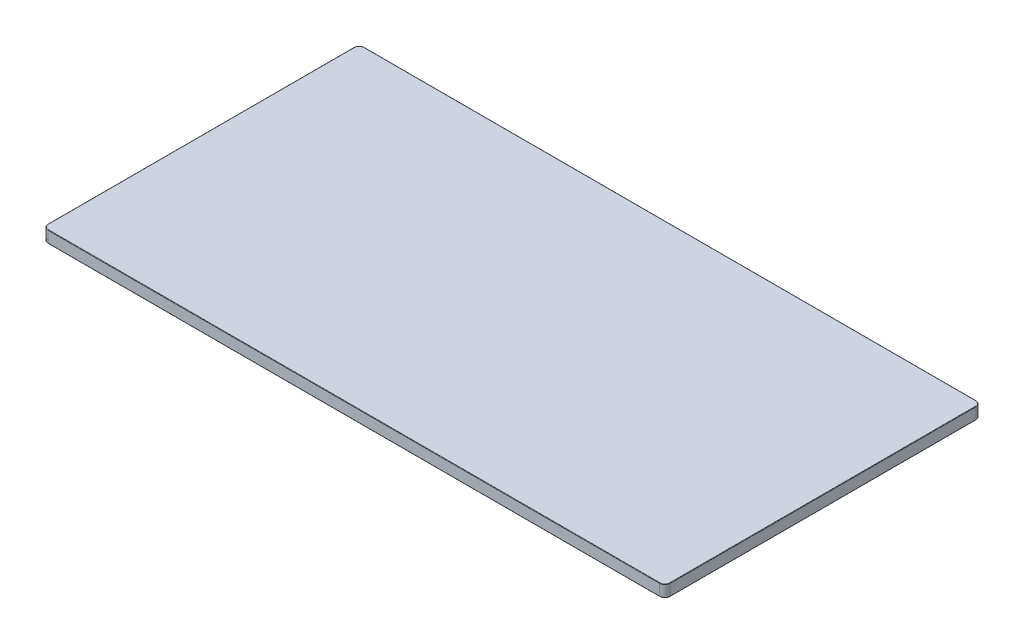
ISO-10303-21;
HEADER;
FILE_DESCRIPTION(('STEP AP214'),'2;1');
FILE_NAME('part.step','',(''),(''),'','','');
FILE_SCHEMA(('AUTOMOTIVE_DESIGN { 1 0 10303 214 1 1 1 1 }'));
ENDSEC;
DATA;
#1=APPLICATION_CONTEXT('core data for automotive mechanical design processes');
#2=APPLICATION_PROTOCOL_DEFINITION('international standard','automotive_design',2000,#1);
#3=PRODUCT_CONTEXT('',#1,'mechanical');
#4=PRODUCT('Part','Part','',(#3));
#5=PRODUCT_RELATED_PRODUCT_CATEGORY('part','',(#4));
#6=PRODUCT_DEFINITION_FORMATION('','',#4);
#7=PRODUCT_DEFINITION_CONTEXT('part definition',#1,'design');
#8=PRODUCT_DEFINITION('design','',#6,#7);
#9=PRODUCT_DEFINITION_SHAPE('','',#8);
#10=(LENGTH_UNIT() NAMED_UNIT(*) SI_UNIT(.MILLI.,.METRE.));
#11=(NAMED_UNIT(*) PLANE_ANGLE_UNIT() SI_UNIT($,.RADIAN.));
#12=(NAMED_UNIT(*) SI_UNIT($,.STERADIAN.) SOLID_ANGLE_UNIT());
#13=UNCERTAINTY_MEASURE_WITH_UNIT(LENGTH_MEASURE(1.E-05),#10,'distance_accuracy_value','');
#14=(GEOMETRIC_REPRESENTATION_CONTEXT(3) GLOBAL_UNCERTAINTY_ASSIGNED_CONTEXT((#13)) GLOBAL_UNIT_ASSIGNED_CONTEXT((#10,
#11,#12)) REPRESENTATION_CONTEXT('',''));
#15=CARTESIAN_POINT('',(0.,0.,0.));
#16=DIRECTION('',(0.,0.,1.));
#17=DIRECTION('',(1.,0.,0.));
#18=AXIS2_PLACEMENT_3D('',#15,#16,#17);
#19=CARTESIAN_POINT('',(749.3,18058.4822993149,381.));
#20=DIRECTION('',(-1.,0.,0.));
#21=DIRECTION('',(0.,0.,1.));
#22=AXIS2_PLACEMENT_3D('',#19,#20,#21);
#23=PLANE('',#22);
#24=DIRECTION('',(0.,-1.,0.));
#25=VECTOR('',#24,1.);
#26=CARTESIAN_POINT('',(749.3,18058.4822993149,368.3));
#27=LINE('',#26,#25);
#28=CARTESIAN_POINT('',(749.3,18057.4822993149,368.3));
#29=VERTEX_POINT('',#28);
#30=CARTESIAN_POINT('',(749.3,18030.9072993149,368.3));
#31=VERTEX_POINT('',#30);
#32=EDGE_CURVE('E289',#29,#31,#27,.T.);
#33=ORIENTED_EDGE('',*,*,#32,.T.);
#34=DIRECTION('',(0.,0.,-1.));
#35=VECTOR('',#34,1.);
#36=CARTESIAN_POINT('',(749.3,18030.9072993149,-368.3));
#37=LINE('',#36,#35);
#38=CARTESIAN_POINT('',(749.3,18030.9072993149,-368.3));
#39=VERTEX_POINT('',#38);
#40=EDGE_CURVE('E206',#31,#39,#37,.T.);
#41=ORIENTED_EDGE('',*,*,#40,.T.);
#42=DIRECTION('',(0.,-1.,0.));
#43=VECTOR('',#42,1.);
#44=CARTESIAN_POINT('',(749.3,18058.4822993149,-368.3));
#45=LINE('',#44,#43);
#46=CARTESIAN_POINT('',(749.3,18057.4822993149,-368.3));
#47=VERTEX_POINT('',#46);
#48=EDGE_CURVE('E298',#39,#47,#45,.F.);
#49=ORIENTED_EDGE('',*,*,#48,.T.);
#50=DIRECTION('',(0.,0.,-1.));
#51=VECTOR('',#50,1.);
#52=CARTESIAN_POINT('',(749.3,18057.4822993149,381.));
#53=LINE('',#52,#51);
#54=EDGE_CURVE('E204',#47,#29,#53,.F.);
#55=ORIENTED_EDGE('',*,*,#54,.T.);
#56=EDGE_LOOP('',(#33,#41,#49,#55));
#57=FACE_BOUND('',#56,.T.);
#58=ADVANCED_FACE('F33',(#57),#23,.F.);
#59=CARTESIAN_POINT('',(-749.3,18058.4822993149,-381.));
#60=DIRECTION('',(0.,0.,1.));
#61=DIRECTION('',(1.,0.,0.));
#62=AXIS2_PLACEMENT_3D('',#59,#60,#61);
#63=PLANE('',#62);
#64=DIRECTION('',(0.,-1.,0.));
#65=VECTOR('',#64,1.);
#66=CARTESIAN_POINT('',(736.6,18058.4822993149,-381.));
#67=LINE('',#66,#65);
#68=CARTESIAN_POINT('',(736.6,18057.4822993149,-381.));
#69=VERTEX_POINT('',#68);
#70=CARTESIAN_POINT('',(736.6,18030.9072993149,-381.));
#71=VERTEX_POINT('',#70);
#72=EDGE_CURVE('E304',#69,#71,#67,.T.);
#73=ORIENTED_EDGE('',*,*,#72,.T.);
#74=DIRECTION('',(-1.,0.,0.));
#75=VECTOR('',#74,1.);
#76=CARTESIAN_POINT('',(-736.6,18030.9072993149,-381.));
#77=LINE('',#76,#75);
#78=CARTESIAN_POINT('',(-736.6,18030.9072993149,-381.));
#79=VERTEX_POINT('',#78);
#80=EDGE_CURVE('E198',#71,#79,#77,.T.);
#81=ORIENTED_EDGE('',*,*,#80,.T.);
#82=DIRECTION('',(0.,-1.,0.));
#83=VECTOR('',#82,1.);
#84=CARTESIAN_POINT('',(-736.6,18058.4822993149,-381.));
#85=LINE('',#84,#83);
#86=CARTESIAN_POINT('',(-736.6,18057.4822993149,-381.));
#87=VERTEX_POINT('',#86);
#88=EDGE_CURVE('E249',#79,#87,#85,.F.);
#89=ORIENTED_EDGE('',*,*,#88,.T.);
#90=DIRECTION('',(-1.,0.,0.));
#91=VECTOR('',#90,1.);
#92=CARTESIAN_POINT('',(-749.3,18057.4822993149,-381.));
#93=LINE('',#92,#91);
#94=EDGE_CURVE('E196',#87,#69,#93,.F.);
#95=ORIENTED_EDGE('',*,*,#94,.T.);
#96=EDGE_LOOP('',(#73,#81,#89,#95));
#97=FACE_BOUND('',#96,.T.);
#98=ADVANCED_FACE('F310',(#97),#63,.F.);
#99=CARTESIAN_POINT('',(-749.3,18058.4822993149,381.));
#100=DIRECTION('',(1.,0.,0.));
#101=DIRECTION('',(0.,0.,-1.));
#102=AXIS2_PLACEMENT_3D('',#99,#100,#101);
#103=PLANE('',#102);
#104=DIRECTION('',(0.,-1.,0.));
#105=VECTOR('',#104,1.);
#106=CARTESIAN_POINT('',(-749.3,18058.4822993149,-368.3));
#107=LINE('',#106,#105);
#108=CARTESIAN_POINT('',(-749.3,18057.4822993149,-368.3));
#109=VERTEX_POINT('',#108);
#110=CARTESIAN_POINT('',(-749.3,18030.9072993149,-368.3));
#111=VERTEX_POINT('',#110);
#112=EDGE_CURVE('E172',#109,#111,#107,.T.);
#113=ORIENTED_EDGE('',*,*,#112,.T.);
#114=DIRECTION('',(0.,0.,1.));
#115=VECTOR('',#114,1.);
#116=CARTESIAN_POINT('',(-749.3,18030.9072993149,368.3));
#117=LINE('',#116,#115);
#118=CARTESIAN_POINT('',(-749.3,18030.9072993149,368.3));
#119=VERTEX_POINT('',#118);
#120=EDGE_CURVE('E11',#111,#119,#117,.T.);
#121=ORIENTED_EDGE('',*,*,#120,.T.);
#122=DIRECTION('',(0.,-1.,0.));
#123=VECTOR('',#122,1.);
#124=CARTESIAN_POINT('',(-749.3,18058.4822993149,368.3));
#125=LINE('',#124,#123);
#126=CARTESIAN_POINT('',(-749.3,18057.4822993149,368.3));
#127=VERTEX_POINT('',#126);
#128=EDGE_CURVE('E175',#119,#127,#125,.F.);
#129=ORIENTED_EDGE('',*,*,#128,.T.);
#130=DIRECTION('',(0.,0.,1.));
#131=VECTOR('',#130,1.);
#132=CARTESIAN_POINT('',(-749.3,18057.4822993149,381.));
#133=LINE('',#132,#131);
#134=EDGE_CURVE('E42',#127,#109,#133,.F.);
#135=ORIENTED_EDGE('',*,*,#134,.T.);
#136=EDGE_LOOP('',(#113,#121,#129,#135));
#137=FACE_BOUND('',#136,.T.);
#138=ADVANCED_FACE('F357',(#137),#103,.F.);
#139=CARTESIAN_POINT('',(-749.3,18058.4822993149,381.));
#140=DIRECTION('',(0.,0.,-1.));
#141=DIRECTION('',(-1.,0.,0.));
#142=AXIS2_PLACEMENT_3D('',#139,#140,#141);
#143=PLANE('',#142);
#144=DIRECTION('',(0.,-1.,0.));
#145=VECTOR('',#144,1.);
#146=CARTESIAN_POINT('',(-736.6,18058.4822993149,381.));
#147=LINE('',#146,#145);
#148=CARTESIAN_POINT('',(-736.6,18057.4822993149,381.));
#149=VERTEX_POINT('',#148);
#150=CARTESIAN_POINT('',(-736.6,18030.9072993149,381.));
#151=VERTEX_POINT('',#150);
#152=EDGE_CURVE('E295',#149,#151,#147,.T.);
#153=ORIENTED_EDGE('',*,*,#152,.T.);
#154=DIRECTION('',(1.,0.,0.));
#155=VECTOR('',#154,1.);
#156=CARTESIAN_POINT('',(736.6,18030.9072993149,381.));
#157=LINE('',#156,#155);
#158=CARTESIAN_POINT('',(736.6,18030.9072993149,381.));
#159=VERTEX_POINT('',#158);
#160=EDGE_CURVE('E214',#151,#159,#157,.T.);
#161=ORIENTED_EDGE('',*,*,#160,.T.);
#162=DIRECTION('',(0.,-1.,0.));
#163=VECTOR('',#162,1.);
#164=CARTESIAN_POINT('',(736.6,18058.4822993149,381.));
#165=LINE('',#164,#163);
#166=CARTESIAN_POINT('',(736.6,18057.4822993149,381.));
#167=VERTEX_POINT('',#166);
#168=EDGE_CURVE('E286',#159,#167,#165,.F.);
#169=ORIENTED_EDGE('',*,*,#168,.T.);
#170=DIRECTION('',(1.,0.,0.));
#171=VECTOR('',#170,1.);
#172=CARTESIAN_POINT('',(-749.3,18057.4822993149,381.));
#173=LINE('',#172,#171);
#174=EDGE_CURVE('E212',#167,#149,#173,.F.);
#175=ORIENTED_EDGE('',*,*,#174,.T.);
#176=EDGE_LOOP('',(#153,#161,#169,#175));
#177=FACE_BOUND('',#176,.T.);
#178=ADVANCED_FACE('F292',(#177),#143,.F.);
#179=CARTESIAN_POINT('',(0.,18058.4822993149,0.));
#180=DIRECTION('',(0.,-1.,0.));
#181=DIRECTION('',(0.,0.,-1.));
#182=AXIS2_PLACEMENT_3D('',#179,#180,#181);
#183=PLANE('',#182);
#184=DIRECTION('',(-1.,0.,0.));
#185=VECTOR('',#184,1.);
#186=CARTESIAN_POINT('',(0.,18058.4822993149,-380.));
#187=LINE('',#186,#185);
#188=CARTESIAN_POINT('',(736.6,18058.4822993149,-380.));
#189=VERTEX_POINT('',#188);
#190=CARTESIAN_POINT('',(-736.6,18058.4822993149,-380.));
#191=VERTEX_POINT('',#190);
#192=EDGE_CURVE('E50',#189,#191,#187,.T.);
#193=ORIENTED_EDGE('',*,*,#192,.T.);
#194=CARTESIAN_POINT('',(-736.6,18058.4822993149,-368.3));
#195=DIRECTION('',(0.,-1.,0.));
#196=DIRECTION('',(0.,0.,-1.));
#197=AXIS2_PLACEMENT_3D('',#194,#195,#196);
#198=CIRCLE('',#197,11.7);
#199=CARTESIAN_POINT('',(-748.3,18058.4822993149,-368.3));
#200=VERTEX_POINT('',#199);
#201=EDGE_CURVE('E231',#191,#200,#198,.F.);
#202=ORIENTED_EDGE('',*,*,#201,.T.);
#203=DIRECTION('',(0.,0.,1.));
#204=VECTOR('',#203,1.);
#205=CARTESIAN_POINT('',(-748.3,18058.4822993149,0.));
#206=LINE('',#205,#204);
#207=CARTESIAN_POINT('',(-748.3,18058.4822993149,368.3));
#208=VERTEX_POINT('',#207);
#209=EDGE_CURVE('E219',#200,#208,#206,.T.);
#210=ORIENTED_EDGE('',*,*,#209,.T.);
#211=CARTESIAN_POINT('',(-736.6,18058.4822993149,368.3));
#212=DIRECTION('',(0.,-1.,0.));
#213=DIRECTION('',(0.,0.,-1.));
#214=AXIS2_PLACEMENT_3D('',#211,#212,#213);
#215=CIRCLE('',#214,11.7);
#216=CARTESIAN_POINT('',(-736.6,18058.4822993149,380.));
#217=VERTEX_POINT('',#216);
#218=EDGE_CURVE('E221',#208,#217,#215,.F.);
#219=ORIENTED_EDGE('',*,*,#218,.T.);
#220=DIRECTION('',(1.,0.,0.));
#221=VECTOR('',#220,1.);
#222=CARTESIAN_POINT('',(0.,18058.4822993149,380.));
#223=LINE('',#222,#221);
#224=CARTESIAN_POINT('',(736.6,18058.4822993149,380.));
#225=VERTEX_POINT('',#224);
#226=EDGE_CURVE('E223',#217,#225,#223,.T.);
#227=ORIENTED_EDGE('',*,*,#226,.T.);
#228=CARTESIAN_POINT('',(736.6,18058.4822993149,368.3));
#229=DIRECTION('',(0.,-1.,0.));
#230=DIRECTION('',(0.,0.,-1.));
#231=AXIS2_PLACEMENT_3D('',#228,#229,#230);
#232=CIRCLE('',#231,11.7);
#233=CARTESIAN_POINT('',(748.3,18058.4822993149,368.3));
#234=VERTEX_POINT('',#233);
#235=EDGE_CURVE('E225',#225,#234,#232,.F.);
#236=ORIENTED_EDGE('',*,*,#235,.T.);
#237=DIRECTION('',(0.,0.,-1.));
#238=VECTOR('',#237,1.);
#239=CARTESIAN_POINT('',(748.3,18058.4822993149,0.));
#240=LINE('',#239,#238);
#241=CARTESIAN_POINT('',(748.3,18058.4822993149,-368.3));
#242=VERTEX_POINT('',#241);
#243=EDGE_CURVE('E227',#234,#242,#240,.T.);
#244=ORIENTED_EDGE('',*,*,#243,.T.);
#245=CARTESIAN_POINT('',(736.6,18058.4822993149,-368.3));
#246=DIRECTION('',(0.,-1.,0.));
#247=DIRECTION('',(0.,0.,-1.));
#248=AXIS2_PLACEMENT_3D('',#245,#246,#247);
#249=CIRCLE('',#248,11.7);
#250=EDGE_CURVE('E55',#242,#189,#249,.F.);
#251=ORIENTED_EDGE('',*,*,#250,.T.);
#252=EDGE_LOOP('',(#193,#202,#210,#219,#227,#236,#244,#251));
#253=FACE_BOUND('',#252,.T.);
#254=ADVANCED_FACE('F525',(#253),#183,.F.);
#255=CARTESIAN_POINT('',(0.,18029.9072993149,0.));
#256=DIRECTION('',(0.,-1.,0.));
#257=DIRECTION('',(0.,0.,-1.));
#258=AXIS2_PLACEMENT_3D('',#255,#256,#257);
#259=PLANE('',#258);
#260=DIRECTION('',(0.,0.,1.));
#261=VECTOR('',#260,1.);
#262=CARTESIAN_POINT('',(-748.3,18029.9072993149,-368.3));
#263=LINE('',#262,#261);
#264=CARTESIAN_POINT('',(-748.3,18029.9072993149,368.3));
#265=VERTEX_POINT('',#264);
#266=CARTESIAN_POINT('',(-748.3,18029.9072993149,-368.3));
#267=VERTEX_POINT('',#266);
#268=EDGE_CURVE('E151',#265,#267,#263,.F.);
#269=ORIENTED_EDGE('',*,*,#268,.T.);
#270=CARTESIAN_POINT('',(-736.6,18029.9072993149,-368.3));
#271=DIRECTION('',(0.,-1.,0.));
#272=DIRECTION('',(0.,0.,-1.));
#273=AXIS2_PLACEMENT_3D('',#270,#271,#272);
#274=CIRCLE('',#273,11.7);
#275=CARTESIAN_POINT('',(-736.6,18029.9072993149,-380.));
#276=VERTEX_POINT('',#275);
#277=EDGE_CURVE('E188',#267,#276,#274,.T.);
#278=ORIENTED_EDGE('',*,*,#277,.T.);
#279=DIRECTION('',(-1.,0.,0.));
#280=VECTOR('',#279,1.);
#281=CARTESIAN_POINT('',(736.6,18029.9072993149,-380.));
#282=LINE('',#281,#280);
#283=CARTESIAN_POINT('',(736.6,18029.9072993149,-380.));
#284=VERTEX_POINT('',#283);
#285=EDGE_CURVE('E186',#276,#284,#282,.F.);
#286=ORIENTED_EDGE('',*,*,#285,.T.);
#287=CARTESIAN_POINT('',(736.6,18029.9072993149,-368.3));
#288=DIRECTION('',(0.,-1.,0.));
#289=DIRECTION('',(0.,0.,-1.));
#290=AXIS2_PLACEMENT_3D('',#287,#288,#289);
#291=CIRCLE('',#290,11.7);
#292=CARTESIAN_POINT('',(748.3,18029.9072993149,-368.3));
#293=VERTEX_POINT('',#292);
#294=EDGE_CURVE('E184',#284,#293,#291,.T.);
#295=ORIENTED_EDGE('',*,*,#294,.T.);
#296=DIRECTION('',(0.,0.,-1.));
#297=VECTOR('',#296,1.);
#298=CARTESIAN_POINT('',(748.3,18029.9072993149,368.3));
#299=LINE('',#298,#297);
#300=CARTESIAN_POINT('',(748.3,18029.9072993149,368.3));
#301=VERTEX_POINT('',#300);
#302=EDGE_CURVE('E182',#293,#301,#299,.F.);
#303=ORIENTED_EDGE('',*,*,#302,.T.);
#304=CARTESIAN_POINT('',(736.6,18029.9072993149,368.3));
#305=DIRECTION('',(0.,-1.,0.));
#306=DIRECTION('',(0.,0.,-1.));
#307=AXIS2_PLACEMENT_3D('',#304,#305,#306);
#308=CIRCLE('',#307,11.7);
#309=CARTESIAN_POINT('',(736.6,18029.9072993149,380.));
#310=VERTEX_POINT('',#309);
#311=EDGE_CURVE('E180',#301,#310,#308,.T.);
#312=ORIENTED_EDGE('',*,*,#311,.T.);
#313=DIRECTION('',(1.,0.,0.));
#314=VECTOR('',#313,1.);
#315=CARTESIAN_POINT('',(-736.6,18029.9072993149,380.));
#316=LINE('',#315,#314);
#317=CARTESIAN_POINT('',(-736.6,18029.9072993149,380.));
#318=VERTEX_POINT('',#317);
#319=EDGE_CURVE('E154',#310,#318,#316,.F.);
#320=ORIENTED_EDGE('',*,*,#319,.T.);
#321=CARTESIAN_POINT('',(-736.6,18029.9072993149,368.3));
#322=DIRECTION('',(0.,-1.,0.));
#323=DIRECTION('',(0.,0.,-1.));
#324=AXIS2_PLACEMENT_3D('',#321,#322,#323);
#325=CIRCLE('',#324,11.7);
#326=EDGE_CURVE('E146',#318,#265,#325,.T.);
#327=ORIENTED_EDGE('',*,*,#326,.T.);
#328=EDGE_LOOP('',(#269,#278,#286,#295,#303,#312,#320,#327));
#329=FACE_BOUND('',#328,.T.);
#330=ADVANCED_FACE('F148',(#329),#259,.T.);
#331=CARTESIAN_POINT('',(736.6,18058.4822993149,-368.3));
#332=DIRECTION('',(0.,-1.,0.));
#333=DIRECTION('',(0.,0.,-1.));
#334=AXIS2_PLACEMENT_3D('',#331,#332,#333);
#335=CYLINDRICAL_SURFACE('',#334,12.7);
#336=ORIENTED_EDGE('',*,*,#48,.F.);
#337=CARTESIAN_POINT('',(736.6,18030.9072993149,-368.3));
#338=DIRECTION('',(0.,-1.,0.));
#339=DIRECTION('',(0.,0.,-1.));
#340=AXIS2_PLACEMENT_3D('',#337,#338,#339);
#341=CIRCLE('',#340,12.7);
#342=EDGE_CURVE('E202',#39,#71,#341,.F.);
#343=ORIENTED_EDGE('',*,*,#342,.T.);
#344=ORIENTED_EDGE('',*,*,#72,.F.);
#345=CARTESIAN_POINT('',(736.6,18057.4822993149,-368.3));
#346=DIRECTION('',(0.,-1.,0.));
#347=DIRECTION('',(0.,0.,-1.));
#348=AXIS2_PLACEMENT_3D('',#345,#346,#347);
#349=CIRCLE('',#348,12.7);
#350=EDGE_CURVE('E200',#69,#47,#349,.T.);
#351=ORIENTED_EDGE('',*,*,#350,.T.);
#352=EDGE_LOOP('',(#336,#343,#344,#351));
#353=FACE_BOUND('',#352,.T.);
#354=ADVANCED_FACE('F361',(#353),#335,.T.);
#355=CARTESIAN_POINT('',(736.6,18058.4822993149,368.3));
#356=DIRECTION('',(0.,-1.,0.));
#357=DIRECTION('',(0.,0.,-1.));
#358=AXIS2_PLACEMENT_3D('',#355,#356,#357);
#359=CYLINDRICAL_SURFACE('',#358,12.7);
#360=ORIENTED_EDGE('',*,*,#168,.F.);
#361=CARTESIAN_POINT('',(736.6,18030.9072993149,368.3));
#362=DIRECTION('',(0.,-1.,0.));
#363=DIRECTION('',(0.,0.,-1.));
#364=AXIS2_PLACEMENT_3D('',#361,#362,#363);
#365=CIRCLE('',#364,12.7);
#366=EDGE_CURVE('E210',#159,#31,#365,.F.);
#367=ORIENTED_EDGE('',*,*,#366,.T.);
#368=ORIENTED_EDGE('',*,*,#32,.F.);
#369=CARTESIAN_POINT('',(736.6,18057.4822993149,368.3));
#370=DIRECTION('',(0.,-1.,0.));
#371=DIRECTION('',(0.,0.,-1.));
#372=AXIS2_PLACEMENT_3D('',#369,#370,#371);
#373=CIRCLE('',#372,12.7);
#374=EDGE_CURVE('E208',#29,#167,#373,.T.);
#375=ORIENTED_EDGE('',*,*,#374,.T.);
#376=EDGE_LOOP('',(#360,#367,#368,#375));
#377=FACE_BOUND('',#376,.T.);
#378=ADVANCED_FACE('F285',(#377),#359,.T.);
#379=CARTESIAN_POINT('',(-736.6,18058.4822993149,-368.3));
#380=DIRECTION('',(0.,-1.,0.));
#381=DIRECTION('',(0.,0.,-1.));
#382=AXIS2_PLACEMENT_3D('',#379,#380,#381);
#383=CYLINDRICAL_SURFACE('',#382,12.7);
#384=ORIENTED_EDGE('',*,*,#88,.F.);
#385=CARTESIAN_POINT('',(-736.6,18030.9072993149,-368.3));
#386=DIRECTION('',(0.,-1.,0.));
#387=DIRECTION('',(0.,0.,-1.));
#388=AXIS2_PLACEMENT_3D('',#385,#386,#387);
#389=CIRCLE('',#388,12.7);
#390=EDGE_CURVE('E193',#79,#111,#389,.F.);
#391=ORIENTED_EDGE('',*,*,#390,.T.);
#392=ORIENTED_EDGE('',*,*,#112,.F.);
#393=CARTESIAN_POINT('',(-736.6,18057.4822993149,-368.3));
#394=DIRECTION('',(0.,-1.,0.));
#395=DIRECTION('',(0.,0.,-1.));
#396=AXIS2_PLACEMENT_3D('',#393,#394,#395);
#397=CIRCLE('',#396,12.7);
#398=EDGE_CURVE('E190',#109,#87,#397,.T.);
#399=ORIENTED_EDGE('',*,*,#398,.T.);
#400=EDGE_LOOP('',(#384,#391,#392,#399));
#401=FACE_BOUND('',#400,.T.);
#402=ADVANCED_FACE('F316',(#401),#383,.T.);
#403=CARTESIAN_POINT('',(-736.6,18058.4822993149,368.3));
#404=DIRECTION('',(0.,-1.,0.));
#405=DIRECTION('',(0.,0.,-1.));
#406=AXIS2_PLACEMENT_3D('',#403,#404,#405);
#407=CYLINDRICAL_SURFACE('',#406,12.7);
#408=ORIENTED_EDGE('',*,*,#128,.F.);
#409=CARTESIAN_POINT('',(-736.6,18030.9072993149,368.3));
#410=DIRECTION('',(0.,-1.,0.));
#411=DIRECTION('',(0.,0.,-1.));
#412=AXIS2_PLACEMENT_3D('',#409,#410,#411);
#413=CIRCLE('',#412,12.7);
#414=EDGE_CURVE('E163',#119,#151,#413,.F.);
#415=ORIENTED_EDGE('',*,*,#414,.T.);
#416=ORIENTED_EDGE('',*,*,#152,.F.);
#417=CARTESIAN_POINT('',(-736.6,18057.4822993149,368.3));
#418=DIRECTION('',(0.,-1.,0.));
#419=DIRECTION('',(0.,0.,-1.));
#420=AXIS2_PLACEMENT_3D('',#417,#418,#419);
#421=CIRCLE('',#420,12.7);
#422=EDGE_CURVE('E216',#149,#127,#421,.T.);
#423=ORIENTED_EDGE('',*,*,#422,.T.);
#424=EDGE_LOOP('',(#408,#415,#416,#423));
#425=FACE_BOUND('',#424,.T.);
#426=ADVANCED_FACE('F349',(#425),#407,.T.);
#427=CARTESIAN_POINT('',(736.6,18030.9072993149,368.3));
#428=DIRECTION('',(0.,-1.,0.));
#429=DIRECTION('',(0.,0.,-1.));
#430=AXIS2_PLACEMENT_3D('',#427,#428,#429);
#431=TOROIDAL_SURFACE('',#430,11.7,1.);
#432=CARTESIAN_POINT('',(748.3,18030.9072993149,368.3));
#433=DIRECTION('',(0.,0.,-1.));
#434=DIRECTION('',(-1.,0.,0.));
#435=AXIS2_PLACEMENT_3D('',#432,#433,#434);
#436=CIRCLE('',#435,1.);
#437=EDGE_CURVE('E243',#31,#301,#436,.T.);
#438=ORIENTED_EDGE('',*,*,#437,.F.);
#439=ORIENTED_EDGE('',*,*,#366,.F.);
#440=CARTESIAN_POINT('',(736.6,18030.9072993149,380.));
#441=DIRECTION('',(-1.,0.,0.));
#442=DIRECTION('',(0.,0.,1.));
#443=AXIS2_PLACEMENT_3D('',#440,#441,#442);
#444=CIRCLE('',#443,1.);
#445=EDGE_CURVE('E246',#310,#159,#444,.T.);
#446=ORIENTED_EDGE('',*,*,#445,.F.);
#447=ORIENTED_EDGE('',*,*,#311,.F.);
#448=EDGE_LOOP('',(#438,#439,#446,#447));
#449=FACE_BOUND('',#448,.T.);
#450=ADVANCED_FACE('F339',(#449),#431,.T.);
#451=CARTESIAN_POINT('',(-749.3,18030.9072993149,380.));
#452=DIRECTION('',(-1.,0.,0.));
#453=DIRECTION('',(0.,0.,1.));
#454=AXIS2_PLACEMENT_3D('',#451,#452,#453);
#455=CYLINDRICAL_SURFACE('',#454,1.);
#456=ORIENTED_EDGE('',*,*,#445,.T.);
#457=ORIENTED_EDGE('',*,*,#160,.F.);
#458=CARTESIAN_POINT('',(-736.6,18030.9072993149,380.));
#459=DIRECTION('',(-1.,0.,0.));
#460=DIRECTION('',(0.,0.,1.));
#461=AXIS2_PLACEMENT_3D('',#458,#459,#460);
#462=CIRCLE('',#461,1.);
#463=EDGE_CURVE('E241',#318,#151,#462,.T.);
#464=ORIENTED_EDGE('',*,*,#463,.F.);
#465=ORIENTED_EDGE('',*,*,#319,.F.);
#466=EDGE_LOOP('',(#456,#457,#464,#465));
#467=FACE_BOUND('',#466,.T.);
#468=ADVANCED_FACE('F341',(#467),#455,.T.);
#469=CARTESIAN_POINT('',(748.3,18030.9072993149,381.));
#470=DIRECTION('',(0.,0.,1.));
#471=DIRECTION('',(1.,0.,0.));
#472=AXIS2_PLACEMENT_3D('',#469,#470,#471);
#473=CYLINDRICAL_SURFACE('',#472,1.);
#474=ORIENTED_EDGE('',*,*,#437,.T.);
#475=ORIENTED_EDGE('',*,*,#302,.F.);
#476=CARTESIAN_POINT('',(748.3,18030.9072993149,-368.3));
#477=DIRECTION('',(0.,0.,-1.));
#478=DIRECTION('',(-1.,0.,0.));
#479=AXIS2_PLACEMENT_3D('',#476,#477,#478);
#480=CIRCLE('',#479,1.);
#481=EDGE_CURVE('E166',#39,#293,#480,.T.);
#482=ORIENTED_EDGE('',*,*,#481,.F.);
#483=ORIENTED_EDGE('',*,*,#40,.F.);
#484=EDGE_LOOP('',(#474,#475,#482,#483));
#485=FACE_BOUND('',#484,.T.);
#486=ADVANCED_FACE('F334',(#485),#473,.T.);
#487=CARTESIAN_POINT('',(-736.6,18030.9072993149,368.3));
#488=DIRECTION('',(0.,-1.,0.));
#489=DIRECTION('',(0.,0.,-1.));
#490=AXIS2_PLACEMENT_3D('',#487,#488,#489);
#491=TOROIDAL_SURFACE('',#490,11.7,1.);
#492=ORIENTED_EDGE('',*,*,#463,.T.);
#493=ORIENTED_EDGE('',*,*,#414,.F.);
#494=CARTESIAN_POINT('',(-748.3,18030.9072993149,368.3));
#495=DIRECTION('',(0.,0.,-1.));
#496=DIRECTION('',(-1.,0.,0.));
#497=AXIS2_PLACEMENT_3D('',#494,#495,#496);
#498=CIRCLE('',#497,1.);
#499=EDGE_CURVE('E161',#265,#119,#498,.T.);
#500=ORIENTED_EDGE('',*,*,#499,.F.);
#501=ORIENTED_EDGE('',*,*,#326,.F.);
#502=EDGE_LOOP('',(#492,#493,#500,#501));
#503=FACE_BOUND('',#502,.T.);
#504=ADVANCED_FACE('F162',(#503),#491,.T.);
#505=CARTESIAN_POINT('',(736.6,18030.9072993149,-368.3));
#506=DIRECTION('',(0.,-1.,0.));
#507=DIRECTION('',(0.,0.,-1.));
#508=AXIS2_PLACEMENT_3D('',#505,#506,#507);
#509=TOROIDAL_SURFACE('',#508,11.7,1.);
#510=ORIENTED_EDGE('',*,*,#481,.T.);
#511=ORIENTED_EDGE('',*,*,#294,.F.);
#512=CARTESIAN_POINT('',(736.6,18030.9072993149,-380.));
#513=DIRECTION('',(-1.,0.,0.));
#514=DIRECTION('',(0.,0.,1.));
#515=AXIS2_PLACEMENT_3D('',#512,#513,#514);
#516=CIRCLE('',#515,1.);
#517=EDGE_CURVE('E167',#71,#284,#516,.T.);
#518=ORIENTED_EDGE('',*,*,#517,.F.);
#519=ORIENTED_EDGE('',*,*,#342,.F.);
#520=EDGE_LOOP('',(#510,#511,#518,#519));
#521=FACE_BOUND('',#520,.T.);
#522=ADVANCED_FACE('F329',(#521),#509,.T.);
#523=CARTESIAN_POINT('',(-748.3,18030.9072993149,381.));
#524=DIRECTION('',(0.,0.,-1.));
#525=DIRECTION('',(-1.,0.,0.));
#526=AXIS2_PLACEMENT_3D('',#523,#524,#525);
#527=CYLINDRICAL_SURFACE('',#526,1.);
#528=ORIENTED_EDGE('',*,*,#499,.T.);
#529=ORIENTED_EDGE('',*,*,#120,.F.);
#530=CARTESIAN_POINT('',(-748.3,18030.9072993149,-368.3));
#531=DIRECTION('',(0.,0.,-1.));
#532=DIRECTION('',(-1.,0.,0.));
#533=AXIS2_PLACEMENT_3D('',#530,#531,#532);
#534=CIRCLE('',#533,1.);
#535=EDGE_CURVE('E170',#267,#111,#534,.T.);
#536=ORIENTED_EDGE('',*,*,#535,.F.);
#537=ORIENTED_EDGE('',*,*,#268,.F.);
#538=EDGE_LOOP('',(#528,#529,#536,#537));
#539=FACE_BOUND('',#538,.T.);
#540=ADVANCED_FACE('F169',(#539),#527,.T.);
#541=CARTESIAN_POINT('',(-749.3,18030.9072993149,-380.));
#542=DIRECTION('',(1.,0.,0.));
#543=DIRECTION('',(0.,0.,-1.));
#544=AXIS2_PLACEMENT_3D('',#541,#542,#543);
#545=CYLINDRICAL_SURFACE('',#544,1.);
#546=ORIENTED_EDGE('',*,*,#517,.T.);
#547=ORIENTED_EDGE('',*,*,#285,.F.);
#548=CARTESIAN_POINT('',(-736.6,18030.9072993149,-380.));
#549=DIRECTION('',(-1.,0.,0.));
#550=DIRECTION('',(0.,0.,1.));
#551=AXIS2_PLACEMENT_3D('',#548,#549,#550);
#552=CIRCLE('',#551,1.);
#553=EDGE_CURVE('E234',#79,#276,#552,.T.);
#554=ORIENTED_EDGE('',*,*,#553,.F.);
#555=ORIENTED_EDGE('',*,*,#80,.F.);
#556=EDGE_LOOP('',(#546,#547,#554,#555));
#557=FACE_BOUND('',#556,.T.);
#558=ADVANCED_FACE('F324',(#557),#545,.T.);
#559=CARTESIAN_POINT('',(-736.6,18030.9072993149,-368.3));
#560=DIRECTION('',(0.,-1.,0.));
#561=DIRECTION('',(0.,0.,-1.));
#562=AXIS2_PLACEMENT_3D('',#559,#560,#561);
#563=TOROIDAL_SURFACE('',#562,11.7,1.);
#564=ORIENTED_EDGE('',*,*,#535,.T.);
#565=ORIENTED_EDGE('',*,*,#390,.F.);
#566=ORIENTED_EDGE('',*,*,#553,.T.);
#567=ORIENTED_EDGE('',*,*,#277,.F.);
#568=EDGE_LOOP('',(#564,#565,#566,#567));
#569=FACE_BOUND('',#568,.T.);
#570=ADVANCED_FACE('F321',(#569),#563,.T.);
#571=CARTESIAN_POINT('',(736.6,18057.4822993149,368.3));
#572=DIRECTION('',(0.,-1.,0.));
#573=DIRECTION('',(0.,0.,-1.));
#574=AXIS2_PLACEMENT_3D('',#571,#572,#573);
#575=TOROIDAL_SURFACE('',#574,11.7,1.);
#576=CARTESIAN_POINT('',(736.6,18057.4822993149,380.));
#577=DIRECTION('',(-1.,0.,0.));
#578=DIRECTION('',(0.,0.,1.));
#579=AXIS2_PLACEMENT_3D('',#576,#577,#578);
#580=CIRCLE('',#579,1.);
#581=EDGE_CURVE('E265',#167,#225,#580,.T.);
#582=ORIENTED_EDGE('',*,*,#581,.F.);
#583=ORIENTED_EDGE('',*,*,#374,.F.);
#584=CARTESIAN_POINT('',(748.3,18057.4822993149,368.3));
#585=DIRECTION('',(0.,0.,-1.));
#586=DIRECTION('',(-1.,0.,0.));
#587=AXIS2_PLACEMENT_3D('',#584,#585,#586);
#588=CIRCLE('',#587,1.);
#589=EDGE_CURVE('E37',#234,#29,#588,.T.);
#590=ORIENTED_EDGE('',*,*,#589,.F.);
#591=ORIENTED_EDGE('',*,*,#235,.F.);
#592=EDGE_LOOP('',(#582,#583,#590,#591));
#593=FACE_BOUND('',#592,.T.);
#594=ADVANCED_FACE('F35',(#593),#575,.T.);
#595=CARTESIAN_POINT('',(748.3,18057.4822993149,0.));
#596=DIRECTION('',(0.,0.,-1.));
#597=DIRECTION('',(-1.,0.,0.));
#598=AXIS2_PLACEMENT_3D('',#595,#596,#597);
#599=CYLINDRICAL_SURFACE('',#598,1.);
#600=ORIENTED_EDGE('',*,*,#589,.T.);
#601=ORIENTED_EDGE('',*,*,#54,.F.);
#602=CARTESIAN_POINT('',(748.3,18057.4822993149,-368.3));
#603=DIRECTION('',(0.,0.,-1.));
#604=DIRECTION('',(-1.,0.,0.));
#605=AXIS2_PLACEMENT_3D('',#602,#603,#604);
#606=CIRCLE('',#605,1.);
#607=EDGE_CURVE('E263',#242,#47,#606,.T.);
#608=ORIENTED_EDGE('',*,*,#607,.F.);
#609=ORIENTED_EDGE('',*,*,#243,.F.);
#610=EDGE_LOOP('',(#600,#601,#608,#609));
#611=FACE_BOUND('',#610,.T.);
#612=ADVANCED_FACE('F276',(#611),#599,.T.);
#613=CARTESIAN_POINT('',(0.,18057.4822993149,380.));
#614=DIRECTION('',(1.,0.,0.));
#615=DIRECTION('',(0.,0.,-1.));
#616=AXIS2_PLACEMENT_3D('',#613,#614,#615);
#617=CYLINDRICAL_SURFACE('',#616,1.);
#618=ORIENTED_EDGE('',*,*,#581,.T.);
#619=ORIENTED_EDGE('',*,*,#226,.F.);
#620=CARTESIAN_POINT('',(-736.6,18057.4822993149,380.));
#621=DIRECTION('',(-1.,0.,0.));
#622=DIRECTION('',(0.,0.,1.));
#623=AXIS2_PLACEMENT_3D('',#620,#621,#622);
#624=CIRCLE('',#623,1.);
#625=EDGE_CURVE('E260',#149,#217,#624,.T.);
#626=ORIENTED_EDGE('',*,*,#625,.F.);
#627=ORIENTED_EDGE('',*,*,#174,.F.);
#628=EDGE_LOOP('',(#618,#619,#626,#627));
#629=FACE_BOUND('',#628,.T.);
#630=ADVANCED_FACE('F412',(#629),#617,.T.);
#631=CARTESIAN_POINT('',(736.6,18057.4822993149,-368.3));
#632=DIRECTION('',(0.,-1.,0.));
#633=DIRECTION('',(0.,0.,-1.));
#634=AXIS2_PLACEMENT_3D('',#631,#632,#633);
#635=TOROIDAL_SURFACE('',#634,11.7,1.);
#636=ORIENTED_EDGE('',*,*,#607,.T.);
#637=ORIENTED_EDGE('',*,*,#350,.F.);
#638=CARTESIAN_POINT('',(736.6,18057.4822993149,-380.));
#639=DIRECTION('',(-1.,0.,0.));
#640=DIRECTION('',(0.,0.,1.));
#641=AXIS2_PLACEMENT_3D('',#638,#639,#640);
#642=CIRCLE('',#641,1.);
#643=EDGE_CURVE('E257',#189,#69,#642,.T.);
#644=ORIENTED_EDGE('',*,*,#643,.F.);
#645=ORIENTED_EDGE('',*,*,#250,.F.);
#646=EDGE_LOOP('',(#636,#637,#644,#645));
#647=FACE_BOUND('',#646,.T.);
#648=ADVANCED_FACE('F418',(#647),#635,.T.);
#649=CARTESIAN_POINT('',(-736.6,18057.4822993149,368.3));
#650=DIRECTION('',(0.,-1.,0.));
#651=DIRECTION('',(0.,0.,-1.));
#652=AXIS2_PLACEMENT_3D('',#649,#650,#651);
#653=TOROIDAL_SURFACE('',#652,11.7,1.);
#654=ORIENTED_EDGE('',*,*,#625,.T.);
#655=ORIENTED_EDGE('',*,*,#218,.F.);
#656=CARTESIAN_POINT('',(-748.3,18057.4822993149,368.3));
#657=DIRECTION('',(0.,0.,-1.));
#658=DIRECTION('',(-1.,0.,0.));
#659=AXIS2_PLACEMENT_3D('',#656,#657,#658);
#660=CIRCLE('',#659,1.);
#661=EDGE_CURVE('E254',#127,#208,#660,.T.);
#662=ORIENTED_EDGE('',*,*,#661,.F.);
#663=ORIENTED_EDGE('',*,*,#422,.F.);
#664=EDGE_LOOP('',(#654,#655,#662,#663));
#665=FACE_BOUND('',#664,.T.);
#666=ADVANCED_FACE('F425',(#665),#653,.T.);
#667=CARTESIAN_POINT('',(0.,18057.4822993149,-380.));
#668=DIRECTION('',(-1.,0.,0.));
#669=DIRECTION('',(0.,0.,1.));
#670=AXIS2_PLACEMENT_3D('',#667,#668,#669);
#671=CYLINDRICAL_SURFACE('',#670,1.);
#672=ORIENTED_EDGE('',*,*,#643,.T.);
#673=ORIENTED_EDGE('',*,*,#94,.F.);
#674=CARTESIAN_POINT('',(-736.6,18057.4822993149,-380.));
#675=DIRECTION('',(-1.,0.,0.));
#676=DIRECTION('',(0.,0.,1.));
#677=AXIS2_PLACEMENT_3D('',#674,#675,#676);
#678=CIRCLE('',#677,1.);
#679=EDGE_CURVE('E252',#191,#87,#678,.T.);
#680=ORIENTED_EDGE('',*,*,#679,.F.);
#681=ORIENTED_EDGE('',*,*,#192,.F.);
#682=EDGE_LOOP('',(#672,#673,#680,#681));
#683=FACE_BOUND('',#682,.T.);
#684=ADVANCED_FACE('F433',(#683),#671,.T.);
#685=CARTESIAN_POINT('',(-748.3,18057.4822993149,0.));
#686=DIRECTION('',(0.,0.,1.));
#687=DIRECTION('',(1.,0.,0.));
#688=AXIS2_PLACEMENT_3D('',#685,#686,#687);
#689=CYLINDRICAL_SURFACE('',#688,1.);
#690=ORIENTED_EDGE('',*,*,#661,.T.);
#691=ORIENTED_EDGE('',*,*,#209,.F.);
#692=CARTESIAN_POINT('',(-748.3,18057.4822993149,-368.3));
#693=DIRECTION('',(0.,0.,-1.));
#694=DIRECTION('',(-1.,0.,0.));
#695=AXIS2_PLACEMENT_3D('',#692,#693,#694);
#696=CIRCLE('',#695,1.);
#697=EDGE_CURVE('E250',#109,#200,#696,.T.);
#698=ORIENTED_EDGE('',*,*,#697,.F.);
#699=ORIENTED_EDGE('',*,*,#134,.F.);
#700=EDGE_LOOP('',(#690,#691,#698,#699));
#701=FACE_BOUND('',#700,.T.);
#702=ADVANCED_FACE('F441',(#701),#689,.T.);
#703=CARTESIAN_POINT('',(-736.6,18057.4822993149,-368.3));
#704=DIRECTION('',(0.,-1.,0.));
#705=DIRECTION('',(0.,0.,-1.));
#706=AXIS2_PLACEMENT_3D('',#703,#704,#705);
#707=TOROIDAL_SURFACE('',#706,11.7,1.);
#708=ORIENTED_EDGE('',*,*,#679,.T.);
#709=ORIENTED_EDGE('',*,*,#398,.F.);
#710=ORIENTED_EDGE('',*,*,#697,.T.);
#711=ORIENTED_EDGE('',*,*,#201,.F.);
#712=EDGE_LOOP('',(#708,#709,#710,#711));
#713=FACE_BOUND('',#712,.T.);
#714=ADVANCED_FACE('F449',(#713),#707,.T.);
#715=CLOSED_SHELL('',(#58,#98,#138,#178,#254,#330,#354,#378,#402,#426,#450,#468,#486,#504,#522,
#540,#558,#570,#594,#612,#630,#648,#666,#684,#702,#714));
#716=MANIFOLD_SOLID_BREP('B2',#715);
#717=ADVANCED_BREP_SHAPE_REPRESENTATION('',(#18,#716),#14);
#718=SHAPE_DEFINITION_REPRESENTATION(#9,#717);
ENDSEC;
END-ISO-10303-21;
